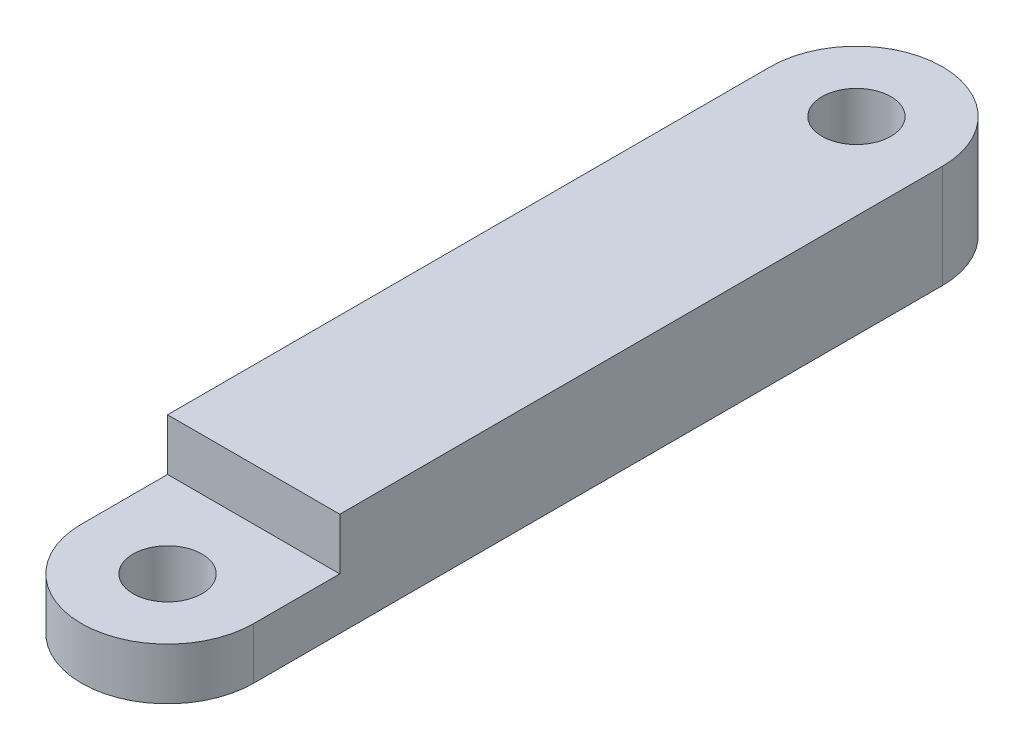
ISO-10303-21;
HEADER;
FILE_DESCRIPTION(('STEP AP214'),'2;1');
FILE_NAME('part.step','',(''),(''),'','','');
FILE_SCHEMA(('AUTOMOTIVE_DESIGN { 1 0 10303 214 1 1 1 1 }'));
ENDSEC;
DATA;
#1=APPLICATION_CONTEXT('core data for automotive mechanical design processes');
#2=APPLICATION_PROTOCOL_DEFINITION('international standard','automotive_design',2000,#1);
#3=PRODUCT_CONTEXT('',#1,'mechanical');
#4=PRODUCT('Part','Part','',(#3));
#5=PRODUCT_RELATED_PRODUCT_CATEGORY('part','',(#4));
#6=PRODUCT_DEFINITION_FORMATION('','',#4);
#7=PRODUCT_DEFINITION_CONTEXT('part definition',#1,'design');
#8=PRODUCT_DEFINITION('design','',#6,#7);
#9=PRODUCT_DEFINITION_SHAPE('','',#8);
#10=(LENGTH_UNIT() NAMED_UNIT(*) SI_UNIT(.MILLI.,.METRE.));
#11=(NAMED_UNIT(*) PLANE_ANGLE_UNIT() SI_UNIT($,.RADIAN.));
#12=(NAMED_UNIT(*) SI_UNIT($,.STERADIAN.) SOLID_ANGLE_UNIT());
#13=UNCERTAINTY_MEASURE_WITH_UNIT(LENGTH_MEASURE(1.E-05),#10,'distance_accuracy_value','');
#14=(GEOMETRIC_REPRESENTATION_CONTEXT(3) GLOBAL_UNCERTAINTY_ASSIGNED_CONTEXT((#13)) GLOBAL_UNIT_ASSIGNED_CONTEXT((#10,
#11,#12)) REPRESENTATION_CONTEXT('',''));
#15=CARTESIAN_POINT('',(0.,0.,0.));
#16=DIRECTION('',(0.,0.,1.));
#17=DIRECTION('',(1.,0.,0.));
#18=AXIS2_PLACEMENT_3D('',#15,#16,#17);
#19=CARTESIAN_POINT('',(-5.,-3.,0.));
#20=DIRECTION('',(1.,0.,0.));
#21=DIRECTION('',(0.,0.,-1.));
#22=AXIS2_PLACEMENT_3D('',#19,#20,#21);
#23=PLANE('',#22);
#24=DIRECTION('',(0.,0.,1.));
#25=VECTOR('',#24,1.);
#26=CARTESIAN_POINT('',(-4.99999999999999,0.,46.0415754513296));
#27=LINE('',#26,#25);
#28=CARTESIAN_POINT('',(-4.99999999999999,0.,35.));
#29=VERTEX_POINT('',#28);
#30=CARTESIAN_POINT('',(-4.99999999999999,0.,40.));
#31=VERTEX_POINT('',#30);
#32=EDGE_CURVE('E104',#29,#31,#27,.T.);
#33=ORIENTED_EDGE('',*,*,#32,.F.);
#34=DIRECTION('',(0.,1.,0.));
#35=VECTOR('',#34,1.);
#36=CARTESIAN_POINT('',(-4.99999999999999,0.,35.));
#37=LINE('',#36,#35);
#38=CARTESIAN_POINT('',(-4.99999999999999,3.,35.));
#39=VERTEX_POINT('',#38);
#40=EDGE_CURVE('E103',#29,#39,#37,.T.);
#41=ORIENTED_EDGE('',*,*,#40,.T.);
#42=DIRECTION('',(0.,0.,-1.));
#43=VECTOR('',#42,1.);
#44=CARTESIAN_POINT('',(-5.,3.,0.));
#45=LINE('',#44,#43);
#46=CARTESIAN_POINT('',(-5.,3.,0.));
#47=VERTEX_POINT('',#46);
#48=EDGE_CURVE('E121',#39,#47,#45,.T.);
#49=ORIENTED_EDGE('',*,*,#48,.T.);
#50=DIRECTION('',(0.,1.,0.));
#51=VECTOR('',#50,1.);
#52=CARTESIAN_POINT('',(-5.,-3.,0.));
#53=LINE('',#52,#51);
#54=CARTESIAN_POINT('',(-5.,-3.,0.));
#55=VERTEX_POINT('',#54);
#56=EDGE_CURVE('E44',#55,#47,#53,.T.);
#57=ORIENTED_EDGE('',*,*,#56,.F.);
#58=DIRECTION('',(0.,0.,-1.));
#59=VECTOR('',#58,1.);
#60=CARTESIAN_POINT('',(-5.,-3.,0.));
#61=LINE('',#60,#59);
#62=CARTESIAN_POINT('',(-4.99999999999999,-3.,40.));
#63=VERTEX_POINT('',#62);
#64=EDGE_CURVE('E59',#63,#55,#61,.T.);
#65=ORIENTED_EDGE('',*,*,#64,.F.);
#66=DIRECTION('',(0.,1.,0.));
#67=VECTOR('',#66,1.);
#68=CARTESIAN_POINT('',(-4.99999999999999,-3.,40.));
#69=LINE('',#68,#67);
#70=EDGE_CURVE('E143',#63,#31,#69,.T.);
#71=ORIENTED_EDGE('',*,*,#70,.T.);
#72=EDGE_LOOP('',(#33,#41,#49,#57,#65,#71));
#73=FACE_BOUND('',#72,.T.);
#74=ADVANCED_FACE('F36',(#73),#23,.F.);
#75=CARTESIAN_POINT('',(0.,-3.,0.));
#76=DIRECTION('',(0.,1.,0.));
#77=DIRECTION('',(0.,0.,1.));
#78=AXIS2_PLACEMENT_3D('',#75,#76,#77);
#79=CYLINDRICAL_SURFACE('',#78,5.);
#80=ORIENTED_EDGE('',*,*,#56,.T.);
#81=CARTESIAN_POINT('',(0.,3.,0.));
#82=DIRECTION('',(0.,1.,0.));
#83=DIRECTION('',(0.,0.,1.));
#84=AXIS2_PLACEMENT_3D('',#81,#82,#83);
#85=CIRCLE('',#84,5.);
#86=CARTESIAN_POINT('',(5.,3.,0.));
#87=VERTEX_POINT('',#86);
#88=EDGE_CURVE('E124',#87,#47,#85,.T.);
#89=ORIENTED_EDGE('',*,*,#88,.F.);
#90=DIRECTION('',(0.,1.,0.));
#91=VECTOR('',#90,1.);
#92=CARTESIAN_POINT('',(5.,-3.,0.));
#93=LINE('',#92,#91);
#94=CARTESIAN_POINT('',(5.,-3.,0.));
#95=VERTEX_POINT('',#94);
#96=EDGE_CURVE('E146',#95,#87,#93,.T.);
#97=ORIENTED_EDGE('',*,*,#96,.F.);
#98=CARTESIAN_POINT('',(0.,-3.,0.));
#99=DIRECTION('',(0.,1.,0.));
#100=DIRECTION('',(0.,0.,1.));
#101=AXIS2_PLACEMENT_3D('',#98,#99,#100);
#102=CIRCLE('',#101,5.);
#103=EDGE_CURVE('E140',#95,#55,#102,.T.);
#104=ORIENTED_EDGE('',*,*,#103,.T.);
#105=EDGE_LOOP('',(#80,#89,#97,#104));
#106=FACE_BOUND('',#105,.T.);
#107=ADVANCED_FACE('F156',(#106),#79,.T.);
#108=CARTESIAN_POINT('',(5.,-3.,0.));
#109=DIRECTION('',(1.,0.,0.));
#110=DIRECTION('',(0.,0.,-1.));
#111=AXIS2_PLACEMENT_3D('',#108,#109,#110);
#112=PLANE('',#111);
#113=DIRECTION('',(0.,1.,0.));
#114=VECTOR('',#113,1.);
#115=CARTESIAN_POINT('',(5.,0.,35.));
#116=LINE('',#115,#114);
#117=CARTESIAN_POINT('',(5.,0.,35.));
#118=VERTEX_POINT('',#117);
#119=CARTESIAN_POINT('',(5.,3.,35.));
#120=VERTEX_POINT('',#119);
#121=EDGE_CURVE('E51',#118,#120,#116,.T.);
#122=ORIENTED_EDGE('',*,*,#121,.F.);
#123=DIRECTION('',(0.,0.,-1.));
#124=VECTOR('',#123,1.);
#125=CARTESIAN_POINT('',(5.,0.,35.));
#126=LINE('',#125,#124);
#127=CARTESIAN_POINT('',(5.,0.,40.));
#128=VERTEX_POINT('',#127);
#129=EDGE_CURVE('E91',#128,#118,#126,.T.);
#130=ORIENTED_EDGE('',*,*,#129,.F.);
#131=DIRECTION('',(0.,1.,0.));
#132=VECTOR('',#131,1.);
#133=CARTESIAN_POINT('',(5.,-3.,40.));
#134=LINE('',#133,#132);
#135=CARTESIAN_POINT('',(5.,-3.,40.));
#136=VERTEX_POINT('',#135);
#137=EDGE_CURVE('E148',#136,#128,#134,.T.);
#138=ORIENTED_EDGE('',*,*,#137,.F.);
#139=DIRECTION('',(0.,0.,-1.));
#140=VECTOR('',#139,1.);
#141=CARTESIAN_POINT('',(5.,-3.,0.));
#142=LINE('',#141,#140);
#143=EDGE_CURVE('E137',#136,#95,#142,.T.);
#144=ORIENTED_EDGE('',*,*,#143,.T.);
#145=ORIENTED_EDGE('',*,*,#96,.T.);
#146=DIRECTION('',(0.,0.,-1.));
#147=VECTOR('',#146,1.);
#148=CARTESIAN_POINT('',(5.,3.,0.));
#149=LINE('',#148,#147);
#150=EDGE_CURVE('E109',#120,#87,#149,.T.);
#151=ORIENTED_EDGE('',*,*,#150,.F.);
#152=EDGE_LOOP('',(#122,#130,#138,#144,#145,#151));
#153=FACE_BOUND('',#152,.T.);
#154=ADVANCED_FACE('F107',(#153),#112,.T.);
#155=CARTESIAN_POINT('',(0.,-3.,0.));
#156=DIRECTION('',(0.,1.,0.));
#157=DIRECTION('',(0.,0.,1.));
#158=AXIS2_PLACEMENT_3D('',#155,#156,#157);
#159=CYLINDRICAL_SURFACE('',#158,2.);
#160=CARTESIAN_POINT('',(0.,-3.,0.));
#161=DIRECTION('',(0.,1.,0.));
#162=DIRECTION('',(0.,0.,1.));
#163=AXIS2_PLACEMENT_3D('',#160,#161,#162);
#164=CIRCLE('',#163,2.);
#165=CARTESIAN_POINT('',(0.,-3.,2.));
#166=VERTEX_POINT('',#165);
#167=EDGE_CURVE('E130',#166,#166,#164,.T.);
#168=ORIENTED_EDGE('',*,*,#167,.F.);
#169=EDGE_LOOP('',(#168));
#170=FACE_BOUND('',#169,.T.);
#171=CARTESIAN_POINT('',(0.,3.,0.));
#172=DIRECTION('',(0.,1.,0.));
#173=DIRECTION('',(0.,0.,1.));
#174=AXIS2_PLACEMENT_3D('',#171,#172,#173);
#175=CIRCLE('',#174,2.);
#176=CARTESIAN_POINT('',(0.,3.,2.));
#177=VERTEX_POINT('',#176);
#178=EDGE_CURVE('E118',#177,#177,#175,.T.);
#179=ORIENTED_EDGE('',*,*,#178,.T.);
#180=EDGE_LOOP('',(#179));
#181=FACE_BOUND('',#180,.T.);
#182=ADVANCED_FACE('F166',(#170,#181),#159,.F.);
#183=CARTESIAN_POINT('',(0.,-3.,40.));
#184=DIRECTION('',(0.,1.,0.));
#185=DIRECTION('',(0.,0.,1.));
#186=AXIS2_PLACEMENT_3D('',#183,#184,#185);
#187=CYLINDRICAL_SURFACE('',#186,2.);
#188=CARTESIAN_POINT('',(0.,0.,40.));
#189=DIRECTION('',(0.,-1.,0.));
#190=DIRECTION('',(0.,0.,-1.));
#191=AXIS2_PLACEMENT_3D('',#188,#189,#190);
#192=CIRCLE('',#191,2.);
#193=CARTESIAN_POINT('',(0.,0.,38.));
#194=VERTEX_POINT('',#193);
#195=EDGE_CURVE('E111',#194,#194,#192,.F.);
#196=ORIENTED_EDGE('',*,*,#195,.T.);
#197=EDGE_LOOP('',(#196));
#198=FACE_BOUND('',#197,.T.);
#199=CARTESIAN_POINT('',(0.,-3.,40.));
#200=DIRECTION('',(0.,1.,0.));
#201=DIRECTION('',(0.,0.,1.));
#202=AXIS2_PLACEMENT_3D('',#199,#200,#201);
#203=CIRCLE('',#202,2.);
#204=CARTESIAN_POINT('',(0.,-3.,42.));
#205=VERTEX_POINT('',#204);
#206=EDGE_CURVE('E127',#205,#205,#203,.T.);
#207=ORIENTED_EDGE('',*,*,#206,.F.);
#208=EDGE_LOOP('',(#207));
#209=FACE_BOUND('',#208,.T.);
#210=ADVANCED_FACE('F38',(#198,#209),#187,.F.);
#211=CARTESIAN_POINT('',(0.,-3.,40.));
#212=DIRECTION('',(0.,1.,0.));
#213=DIRECTION('',(0.,0.,1.));
#214=AXIS2_PLACEMENT_3D('',#211,#212,#213);
#215=CYLINDRICAL_SURFACE('',#214,5.);
#216=CARTESIAN_POINT('',(0.,0.,40.));
#217=DIRECTION('',(0.,-1.,0.));
#218=DIRECTION('',(0.,0.,-1.));
#219=AXIS2_PLACEMENT_3D('',#216,#217,#218);
#220=CIRCLE('',#219,5.);
#221=EDGE_CURVE('E11',#31,#128,#220,.F.);
#222=ORIENTED_EDGE('',*,*,#221,.F.);
#223=ORIENTED_EDGE('',*,*,#70,.F.);
#224=CARTESIAN_POINT('',(0.,-3.,40.));
#225=DIRECTION('',(0.,1.,0.));
#226=DIRECTION('',(0.,0.,1.));
#227=AXIS2_PLACEMENT_3D('',#224,#225,#226);
#228=CIRCLE('',#227,5.);
#229=EDGE_CURVE('E134',#63,#136,#228,.T.);
#230=ORIENTED_EDGE('',*,*,#229,.T.);
#231=ORIENTED_EDGE('',*,*,#137,.T.);
#232=EDGE_LOOP('',(#222,#223,#230,#231));
#233=FACE_BOUND('',#232,.T.);
#234=ADVANCED_FACE('F152',(#233),#215,.T.);
#235=CARTESIAN_POINT('',(0.,-3.,0.));
#236=DIRECTION('',(0.,1.,0.));
#237=DIRECTION('',(0.,0.,1.));
#238=AXIS2_PLACEMENT_3D('',#235,#236,#237);
#239=PLANE('',#238);
#240=ORIENTED_EDGE('',*,*,#206,.T.);
#241=EDGE_LOOP('',(#240));
#242=FACE_BOUND('',#241,.T.);
#243=ORIENTED_EDGE('',*,*,#167,.T.);
#244=EDGE_LOOP('',(#243));
#245=FACE_BOUND('',#244,.T.);
#246=ORIENTED_EDGE('',*,*,#64,.T.);
#247=ORIENTED_EDGE('',*,*,#103,.F.);
#248=ORIENTED_EDGE('',*,*,#143,.F.);
#249=ORIENTED_EDGE('',*,*,#229,.F.);
#250=EDGE_LOOP('',(#246,#247,#248,#249));
#251=FACE_BOUND('',#250,.T.);
#252=ADVANCED_FACE('F154',(#242,#245,#251),#239,.F.);
#253=CARTESIAN_POINT('',(0.,3.,0.));
#254=DIRECTION('',(0.,1.,0.));
#255=DIRECTION('',(0.,0.,1.));
#256=AXIS2_PLACEMENT_3D('',#253,#254,#255);
#257=PLANE('',#256);
#258=DIRECTION('',(-1.,0.,0.));
#259=VECTOR('',#258,1.);
#260=CARTESIAN_POINT('',(5.,3.,35.));
#261=LINE('',#260,#259);
#262=EDGE_CURVE('E99',#120,#39,#261,.T.);
#263=ORIENTED_EDGE('',*,*,#262,.F.);
#264=ORIENTED_EDGE('',*,*,#150,.T.);
#265=ORIENTED_EDGE('',*,*,#88,.T.);
#266=ORIENTED_EDGE('',*,*,#48,.F.);
#267=EDGE_LOOP('',(#263,#264,#265,#266));
#268=FACE_BOUND('',#267,.T.);
#269=ORIENTED_EDGE('',*,*,#178,.F.);
#270=EDGE_LOOP('',(#269));
#271=FACE_BOUND('',#270,.T.);
#272=ADVANCED_FACE('F160',(#268,#271),#257,.T.);
#273=CARTESIAN_POINT('',(0.,0.,0.));
#274=DIRECTION('',(0.,-1.,0.));
#275=DIRECTION('',(0.,0.,-1.));
#276=AXIS2_PLACEMENT_3D('',#273,#274,#275);
#277=PLANE('',#276);
#278=ORIENTED_EDGE('',*,*,#221,.T.);
#279=ORIENTED_EDGE('',*,*,#129,.T.);
#280=DIRECTION('',(-1.,0.,0.));
#281=VECTOR('',#280,1.);
#282=CARTESIAN_POINT('',(5.,0.,35.));
#283=LINE('',#282,#281);
#284=EDGE_CURVE('E94',#118,#29,#283,.T.);
#285=ORIENTED_EDGE('',*,*,#284,.T.);
#286=ORIENTED_EDGE('',*,*,#32,.T.);
#287=EDGE_LOOP('',(#278,#279,#285,#286));
#288=FACE_BOUND('',#287,.T.);
#289=ORIENTED_EDGE('',*,*,#195,.F.);
#290=EDGE_LOOP('',(#289));
#291=FACE_BOUND('',#290,.T.);
#292=ADVANCED_FACE('F92',(#288,#291),#277,.F.);
#293=CARTESIAN_POINT('',(5.,0.,35.));
#294=DIRECTION('',(0.,0.,-1.));
#295=DIRECTION('',(-1.,0.,0.));
#296=AXIS2_PLACEMENT_3D('',#293,#294,#295);
#297=PLANE('',#296);
#298=ORIENTED_EDGE('',*,*,#262,.T.);
#299=ORIENTED_EDGE('',*,*,#40,.F.);
#300=ORIENTED_EDGE('',*,*,#284,.F.);
#301=ORIENTED_EDGE('',*,*,#121,.T.);
#302=EDGE_LOOP('',(#298,#299,#300,#301));
#303=FACE_BOUND('',#302,.T.);
#304=ADVANCED_FACE('F101',(#303),#297,.F.);
#305=CLOSED_SHELL('',(#74,#107,#154,#182,#210,#234,#252,#272,#292,#304));
#306=MANIFOLD_SOLID_BREP('B2',#305);
#307=ADVANCED_BREP_SHAPE_REPRESENTATION('',(#18,#306),#14);
#308=SHAPE_DEFINITION_REPRESENTATION(#9,#307);
ENDSEC;
END-ISO-10303-21;
